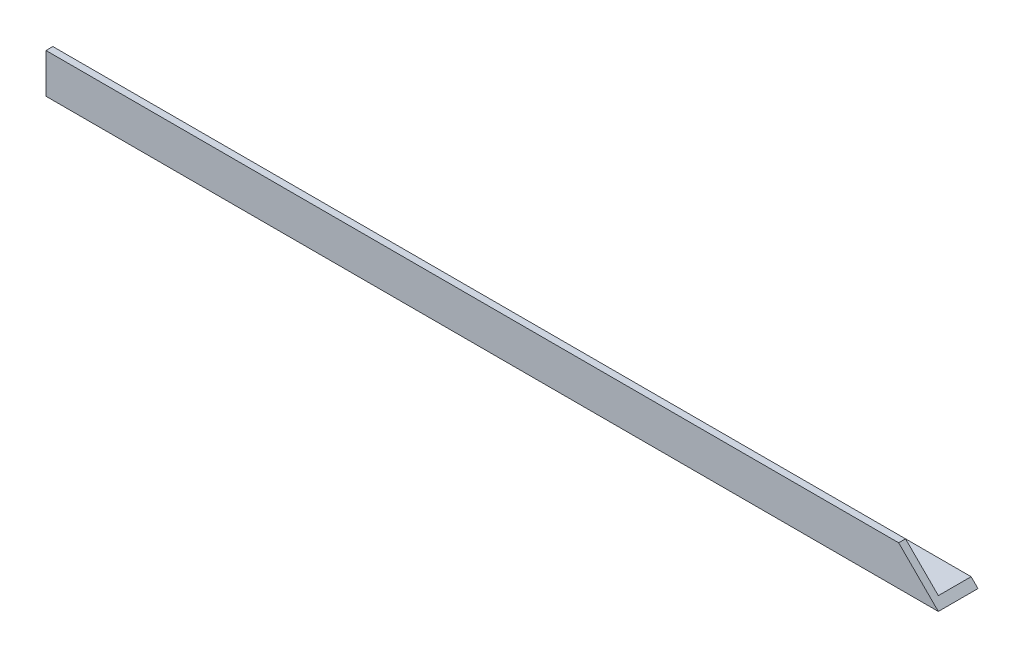
ISO-10303-21;
HEADER;
FILE_DESCRIPTION(('STEP AP214'),'2;1');
FILE_NAME('part.step','',(''),(''),'','','');
FILE_SCHEMA(('AUTOMOTIVE_DESIGN { 1 0 10303 214 1 1 1 1 }'));
ENDSEC;
DATA;
#1=APPLICATION_CONTEXT('core data for automotive mechanical design processes');
#2=APPLICATION_PROTOCOL_DEFINITION('international standard','automotive_design',2000,#1);
#3=PRODUCT_CONTEXT('',#1,'mechanical');
#4=PRODUCT('Part','Part','',(#3));
#5=PRODUCT_RELATED_PRODUCT_CATEGORY('part','',(#4));
#6=PRODUCT_DEFINITION_FORMATION('','',#4);
#7=PRODUCT_DEFINITION_CONTEXT('part definition',#1,'design');
#8=PRODUCT_DEFINITION('design','',#6,#7);
#9=PRODUCT_DEFINITION_SHAPE('','',#8);
#10=(LENGTH_UNIT() NAMED_UNIT(*) SI_UNIT(.MILLI.,.METRE.));
#11=(NAMED_UNIT(*) PLANE_ANGLE_UNIT() SI_UNIT($,.RADIAN.));
#12=(NAMED_UNIT(*) SI_UNIT($,.STERADIAN.) SOLID_ANGLE_UNIT());
#13=UNCERTAINTY_MEASURE_WITH_UNIT(LENGTH_MEASURE(1.E-05),#10,'distance_accuracy_value','');
#14=(GEOMETRIC_REPRESENTATION_CONTEXT(3) GLOBAL_UNCERTAINTY_ASSIGNED_CONTEXT((#13)) GLOBAL_UNIT_ASSIGNED_CONTEXT((#10,
#11,#12)) REPRESENTATION_CONTEXT('',''));
#15=CARTESIAN_POINT('',(0.,0.,0.));
#16=DIRECTION('',(0.,0.,1.));
#17=DIRECTION('',(1.,0.,0.));
#18=AXIS2_PLACEMENT_3D('',#15,#16,#17);
#19=CARTESIAN_POINT('',(450.,20.,0.));
#20=DIRECTION('',(0.,0.,-1.));
#21=DIRECTION('',(0.,1.,0.));
#22=AXIS2_PLACEMENT_3D('',#19,#20,#21);
#23=PLANE('',#22);
#24=DIRECTION('',(-0.707106781186548,0.707106781186547,0.));
#25=VECTOR('',#24,1.);
#26=CARTESIAN_POINT('',(450.,0.,0.));
#27=LINE('',#26,#25);
#28=CARTESIAN_POINT('',(450.,0.,0.));
#29=VERTEX_POINT('',#28);
#30=CARTESIAN_POINT('',(430.,20.,0.));
#31=VERTEX_POINT('',#30);
#32=EDGE_CURVE('E52',#29,#31,#27,.T.);
#33=ORIENTED_EDGE('',*,*,#32,.T.);
#34=DIRECTION('',(-1.,0.,0.));
#35=VECTOR('',#34,1.);
#36=CARTESIAN_POINT('',(450.,20.,0.));
#37=LINE('',#36,#35);
#38=CARTESIAN_POINT('',(0.,20.,0.));
#39=VERTEX_POINT('',#38);
#40=EDGE_CURVE('E88',#31,#39,#37,.T.);
#41=ORIENTED_EDGE('',*,*,#40,.T.);
#42=DIRECTION('',(0.,-1.,0.));
#43=VECTOR('',#42,1.);
#44=CARTESIAN_POINT('',(0.,20.,0.));
#45=LINE('',#44,#43);
#46=CARTESIAN_POINT('',(0.,0.,0.));
#47=VERTEX_POINT('',#46);
#48=EDGE_CURVE('E101',#39,#47,#45,.T.);
#49=ORIENTED_EDGE('',*,*,#48,.T.);
#50=DIRECTION('',(-1.,0.,0.));
#51=VECTOR('',#50,1.);
#52=CARTESIAN_POINT('',(450.,0.,0.));
#53=LINE('',#52,#51);
#54=EDGE_CURVE('E11',#29,#47,#53,.T.);
#55=ORIENTED_EDGE('',*,*,#54,.F.);
#56=EDGE_LOOP('',(#33,#41,#49,#55));
#57=FACE_BOUND('',#56,.T.);
#58=ADVANCED_FACE('F37',(#57),#23,.F.);
#59=CARTESIAN_POINT('',(450.,0.,-20.));
#60=DIRECTION('',(0.,0.,1.));
#61=DIRECTION('',(1.,0.,0.));
#62=AXIS2_PLACEMENT_3D('',#59,#60,#61);
#63=PLANE('',#62);
#64=DIRECTION('',(-0.707106781186548,0.707106781186547,0.));
#65=VECTOR('',#64,1.);
#66=CARTESIAN_POINT('',(450.,0.,-20.));
#67=LINE('',#66,#65);
#68=CARTESIAN_POINT('',(450.,0.,-20.));
#69=VERTEX_POINT('',#68);
#70=CARTESIAN_POINT('',(446.538821532984,3.46117846701572,-20.));
#71=VERTEX_POINT('',#70);
#72=EDGE_CURVE('E121',#69,#71,#67,.T.);
#73=ORIENTED_EDGE('',*,*,#72,.F.);
#74=DIRECTION('',(-1.,0.,0.));
#75=VECTOR('',#74,1.);
#76=CARTESIAN_POINT('',(450.,0.,-20.));
#77=LINE('',#76,#75);
#78=CARTESIAN_POINT('',(0.,0.,-20.));
#79=VERTEX_POINT('',#78);
#80=EDGE_CURVE('E45',#69,#79,#77,.T.);
#81=ORIENTED_EDGE('',*,*,#80,.T.);
#82=DIRECTION('',(0.,1.,0.));
#83=VECTOR('',#82,1.);
#84=CARTESIAN_POINT('',(0.,0.,-20.));
#85=LINE('',#84,#83);
#86=CARTESIAN_POINT('',(0.,3.46117846701572,-20.));
#87=VERTEX_POINT('',#86);
#88=EDGE_CURVE('E118',#79,#87,#85,.T.);
#89=ORIENTED_EDGE('',*,*,#88,.T.);
#90=DIRECTION('',(-1.,0.,0.));
#91=VECTOR('',#90,1.);
#92=CARTESIAN_POINT('',(450.,3.46117846701572,-20.));
#93=LINE('',#92,#91);
#94=EDGE_CURVE('E109',#71,#87,#93,.T.);
#95=ORIENTED_EDGE('',*,*,#94,.F.);
#96=EDGE_LOOP('',(#73,#81,#89,#95));
#97=FACE_BOUND('',#96,.T.);
#98=ADVANCED_FACE('F116',(#97),#63,.F.);
#99=CARTESIAN_POINT('',(450.,3.46117846701572,-20.));
#100=DIRECTION('',(0.,-1.,0.));
#101=DIRECTION('',(0.,0.,-1.));
#102=AXIS2_PLACEMENT_3D('',#99,#100,#101);
#103=PLANE('',#102);
#104=DIRECTION('',(0.,0.,1.));
#105=VECTOR('',#104,1.);
#106=CARTESIAN_POINT('',(446.538821532984,3.46117846701572,-20.));
#107=LINE('',#106,#105);
#108=CARTESIAN_POINT('',(446.538821532984,3.46117846701572,-3.46117846701572));
#109=VERTEX_POINT('',#108);
#110=EDGE_CURVE('E127',#71,#109,#107,.T.);
#111=ORIENTED_EDGE('',*,*,#110,.F.);
#112=ORIENTED_EDGE('',*,*,#94,.T.);
#113=DIRECTION('',(0.,0.,1.));
#114=VECTOR('',#113,1.);
#115=CARTESIAN_POINT('',(0.,3.46117846701572,-20.));
#116=LINE('',#115,#114);
#117=CARTESIAN_POINT('',(0.,3.46117846701572,-3.46117846701572));
#118=VERTEX_POINT('',#117);
#119=EDGE_CURVE('E97',#87,#118,#116,.T.);
#120=ORIENTED_EDGE('',*,*,#119,.T.);
#121=DIRECTION('',(-1.,0.,0.));
#122=VECTOR('',#121,1.);
#123=CARTESIAN_POINT('',(450.,3.46117846701572,-3.46117846701572));
#124=LINE('',#123,#122);
#125=EDGE_CURVE('E87',#109,#118,#124,.T.);
#126=ORIENTED_EDGE('',*,*,#125,.F.);
#127=EDGE_LOOP('',(#111,#112,#120,#126));
#128=FACE_BOUND('',#127,.T.);
#129=ADVANCED_FACE('F141',(#128),#103,.F.);
#130=CARTESIAN_POINT('',(450.,3.46117846701572,-3.46117846701572));
#131=DIRECTION('',(0.,0.,1.));
#132=DIRECTION('',(1.,0.,0.));
#133=AXIS2_PLACEMENT_3D('',#130,#131,#132);
#134=PLANE('',#133);
#135=DIRECTION('',(-0.707106781186548,0.707106781186547,0.));
#136=VECTOR('',#135,1.);
#137=CARTESIAN_POINT('',(448.269410766492,1.73058923350786,-3.46117846701572));
#138=LINE('',#137,#136);
#139=CARTESIAN_POINT('',(430.,20.,-3.46117846701572));
#140=VERTEX_POINT('',#139);
#141=EDGE_CURVE('E131',#109,#140,#138,.T.);
#142=ORIENTED_EDGE('',*,*,#141,.F.);
#143=ORIENTED_EDGE('',*,*,#125,.T.);
#144=DIRECTION('',(0.,1.,0.));
#145=VECTOR('',#144,1.);
#146=CARTESIAN_POINT('',(0.,3.46117846701572,-3.46117846701572));
#147=LINE('',#146,#145);
#148=CARTESIAN_POINT('',(0.,20.,-3.46117846701572));
#149=VERTEX_POINT('',#148);
#150=EDGE_CURVE('E91',#118,#149,#147,.T.);
#151=ORIENTED_EDGE('',*,*,#150,.T.);
#152=DIRECTION('',(-1.,0.,0.));
#153=VECTOR('',#152,1.);
#154=CARTESIAN_POINT('',(450.,20.,-3.46117846701572));
#155=LINE('',#154,#153);
#156=EDGE_CURVE('E76',#140,#149,#155,.T.);
#157=ORIENTED_EDGE('',*,*,#156,.F.);
#158=EDGE_LOOP('',(#142,#143,#151,#157));
#159=FACE_BOUND('',#158,.T.);
#160=ADVANCED_FACE('F92',(#159),#134,.F.);
#161=CARTESIAN_POINT('',(450.,20.,-3.46117846701572));
#162=DIRECTION('',(0.,-1.,0.));
#163=DIRECTION('',(0.,0.,-1.));
#164=AXIS2_PLACEMENT_3D('',#161,#162,#163);
#165=PLANE('',#164);
#166=DIRECTION('',(0.,0.,1.));
#167=VECTOR('',#166,1.);
#168=CARTESIAN_POINT('',(430.,20.,-20.));
#169=LINE('',#168,#167);
#170=EDGE_CURVE('E84',#140,#31,#169,.T.);
#171=ORIENTED_EDGE('',*,*,#170,.F.);
#172=ORIENTED_EDGE('',*,*,#156,.T.);
#173=DIRECTION('',(0.,0.,1.));
#174=VECTOR('',#173,1.);
#175=CARTESIAN_POINT('',(0.,20.,-3.46117846701572));
#176=LINE('',#175,#174);
#177=EDGE_CURVE('E81',#149,#39,#176,.T.);
#178=ORIENTED_EDGE('',*,*,#177,.T.);
#179=ORIENTED_EDGE('',*,*,#40,.F.);
#180=EDGE_LOOP('',(#171,#172,#178,#179));
#181=FACE_BOUND('',#180,.T.);
#182=ADVANCED_FACE('F78',(#181),#165,.F.);
#183=CARTESIAN_POINT('',(450.,0.,0.));
#184=DIRECTION('',(0.,1.,0.));
#185=DIRECTION('',(0.,0.,1.));
#186=AXIS2_PLACEMENT_3D('',#183,#184,#185);
#187=PLANE('',#186);
#188=DIRECTION('',(0.,0.,-1.));
#189=VECTOR('',#188,1.);
#190=CARTESIAN_POINT('',(0.,0.,0.));
#191=LINE('',#190,#189);
#192=EDGE_CURVE('E123',#47,#79,#191,.T.);
#193=ORIENTED_EDGE('',*,*,#192,.T.);
#194=ORIENTED_EDGE('',*,*,#80,.F.);
#195=DIRECTION('',(0.,0.,-1.));
#196=VECTOR('',#195,1.);
#197=CARTESIAN_POINT('',(450.,0.,0.));
#198=LINE('',#197,#196);
#199=EDGE_CURVE('E102',#29,#69,#198,.T.);
#200=ORIENTED_EDGE('',*,*,#199,.F.);
#201=ORIENTED_EDGE('',*,*,#54,.T.);
#202=EDGE_LOOP('',(#193,#194,#200,#201));
#203=FACE_BOUND('',#202,.T.);
#204=ADVANCED_FACE('F147',(#203),#187,.F.);
#205=CARTESIAN_POINT('',(0.,0.,0.));
#206=DIRECTION('',(1.,0.,0.));
#207=DIRECTION('',(0.,0.,-1.));
#208=AXIS2_PLACEMENT_3D('',#205,#206,#207);
#209=PLANE('',#208);
#210=ORIENTED_EDGE('',*,*,#48,.F.);
#211=ORIENTED_EDGE('',*,*,#177,.F.);
#212=ORIENTED_EDGE('',*,*,#150,.F.);
#213=ORIENTED_EDGE('',*,*,#119,.F.);
#214=ORIENTED_EDGE('',*,*,#88,.F.);
#215=ORIENTED_EDGE('',*,*,#192,.F.);
#216=EDGE_LOOP('',(#210,#211,#212,#213,#214,#215));
#217=FACE_BOUND('',#216,.T.);
#218=ADVANCED_FACE('F99',(#217),#209,.F.);
#219=CARTESIAN_POINT('',(450.,0.,-20.));
#220=DIRECTION('',(0.707106781186547,0.707106781186548,0.));
#221=DIRECTION('',(-0.707106781186548,0.707106781186547,0.));
#222=AXIS2_PLACEMENT_3D('',#219,#220,#221);
#223=PLANE('',#222);
#224=ORIENTED_EDGE('',*,*,#110,.T.);
#225=ORIENTED_EDGE('',*,*,#141,.T.);
#226=ORIENTED_EDGE('',*,*,#170,.T.);
#227=ORIENTED_EDGE('',*,*,#32,.F.);
#228=ORIENTED_EDGE('',*,*,#199,.T.);
#229=ORIENTED_EDGE('',*,*,#72,.T.);
#230=EDGE_LOOP('',(#224,#225,#226,#227,#228,#229));
#231=FACE_BOUND('',#230,.T.);
#232=ADVANCED_FACE('F138',(#231),#223,.T.);
#233=CLOSED_SHELL('',(#58,#98,#129,#160,#182,#204,#218,#232));
#234=MANIFOLD_SOLID_BREP('B2',#233);
#235=ADVANCED_BREP_SHAPE_REPRESENTATION('',(#18,#234),#14);
#236=SHAPE_DEFINITION_REPRESENTATION(#9,#235);
ENDSEC;
END-ISO-10303-21;
